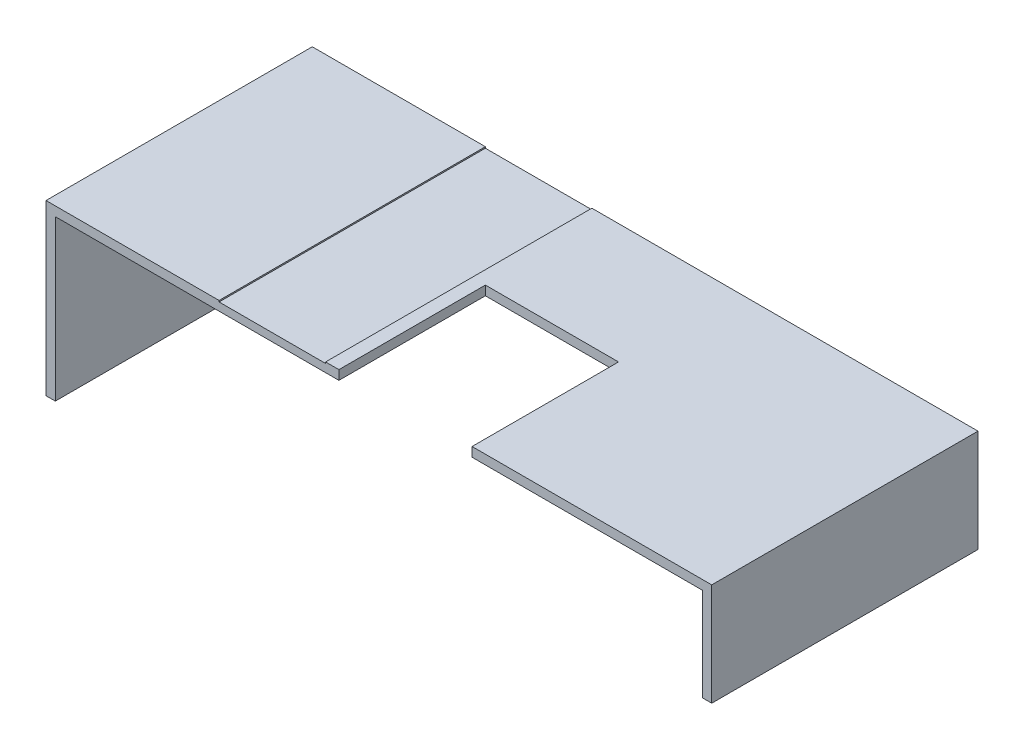
ISO-10303-21;
HEADER;
FILE_DESCRIPTION(('STEP AP214'),'2;1');
FILE_NAME('part.step','',(''),(''),'','','');
FILE_SCHEMA(('AUTOMOTIVE_DESIGN { 1 0 10303 214 1 1 1 1 }'));
ENDSEC;
DATA;
#1=APPLICATION_CONTEXT('core data for automotive mechanical design processes');
#2=APPLICATION_PROTOCOL_DEFINITION('international standard','automotive_design',2000,#1);
#3=PRODUCT_CONTEXT('',#1,'mechanical');
#4=PRODUCT('Part','Part','',(#3));
#5=PRODUCT_RELATED_PRODUCT_CATEGORY('part','',(#4));
#6=PRODUCT_DEFINITION_FORMATION('','',#4);
#7=PRODUCT_DEFINITION_CONTEXT('part definition',#1,'design');
#8=PRODUCT_DEFINITION('design','',#6,#7);
#9=PRODUCT_DEFINITION_SHAPE('','',#8);
#10=(LENGTH_UNIT() NAMED_UNIT(*) SI_UNIT(.MILLI.,.METRE.));
#11=(NAMED_UNIT(*) PLANE_ANGLE_UNIT() SI_UNIT($,.RADIAN.));
#12=(NAMED_UNIT(*) SI_UNIT($,.STERADIAN.) SOLID_ANGLE_UNIT());
#13=UNCERTAINTY_MEASURE_WITH_UNIT(LENGTH_MEASURE(1.E-05),#10,'distance_accuracy_value','');
#14=(GEOMETRIC_REPRESENTATION_CONTEXT(3) GLOBAL_UNCERTAINTY_ASSIGNED_CONTEXT((#13)) GLOBAL_UNIT_ASSIGNED_CONTEXT((#10,
#11,#12)) REPRESENTATION_CONTEXT('',''));
#15=CARTESIAN_POINT('',(0.,0.,0.));
#16=DIRECTION('',(0.,0.,1.));
#17=DIRECTION('',(1.,0.,0.));
#18=AXIS2_PLACEMENT_3D('',#15,#16,#17);
#19=CARTESIAN_POINT('',(0.,70.,0.));
#20=DIRECTION('',(0.,-1.,0.));
#21=DIRECTION('',(0.,0.,-1.));
#22=AXIS2_PLACEMENT_3D('',#19,#20,#21);
#23=PLANE('',#22);
#24=DIRECTION('',(1.,0.,0.));
#25=VECTOR('',#24,1.);
#26=CARTESIAN_POINT('',(-2500.,70.,1000.));
#27=LINE('',#26,#25);
#28=CARTESIAN_POINT('',(-2500.,70.,1000.));
#29=VERTEX_POINT('',#28);
#30=CARTESIAN_POINT('',(-1200.,70.,1000.));
#31=VERTEX_POINT('',#30);
#32=EDGE_CURVE('E146',#29,#31,#27,.T.);
#33=ORIENTED_EDGE('',*,*,#32,.T.);
#34=DIRECTION('',(0.,0.,-1.));
#35=VECTOR('',#34,1.);
#36=CARTESIAN_POINT('',(-1200.,70.,-1.1507914881164E-13));
#37=LINE('',#36,#35);
#38=CARTESIAN_POINT('',(-1200.,70.,-1000.));
#39=VERTEX_POINT('',#38);
#40=EDGE_CURVE('E25',#31,#39,#37,.T.);
#41=ORIENTED_EDGE('',*,*,#40,.T.);
#42=DIRECTION('',(-1.,0.,0.));
#43=VECTOR('',#42,1.);
#44=CARTESIAN_POINT('',(-2500.,70.,-1000.));
#45=LINE('',#44,#43);
#46=CARTESIAN_POINT('',(-2500.,70.,-1000.));
#47=VERTEX_POINT('',#46);
#48=EDGE_CURVE('E138',#39,#47,#45,.T.);
#49=ORIENTED_EDGE('',*,*,#48,.T.);
#50=DIRECTION('',(0.,0.,1.));
#51=VECTOR('',#50,1.);
#52=CARTESIAN_POINT('',(-2500.,70.,1000.));
#53=LINE('',#52,#51);
#54=EDGE_CURVE('E198',#47,#29,#53,.T.);
#55=ORIENTED_EDGE('',*,*,#54,.T.);
#56=EDGE_LOOP('',(#33,#41,#49,#55));
#57=FACE_BOUND('',#56,.T.);
#58=ADVANCED_FACE('F17',(#57),#23,.F.);
#59=CARTESIAN_POINT('',(-2500.,70.,1000.));
#60=DIRECTION('',(0.,0.,-1.));
#61=DIRECTION('',(-1.,0.,0.));
#62=AXIS2_PLACEMENT_3D('',#59,#60,#61);
#63=PLANE('',#62);
#64=DIRECTION('',(1.,0.,0.));
#65=VECTOR('',#64,1.);
#66=CARTESIAN_POINT('',(-2500.,60.,1000.));
#67=LINE('',#66,#65);
#68=CARTESIAN_POINT('',(-1200.,60.,1000.));
#69=VERTEX_POINT('',#68);
#70=CARTESIAN_POINT('',(-400.,60.,1000.));
#71=VERTEX_POINT('',#70);
#72=EDGE_CURVE('E263',#69,#71,#67,.T.);
#73=ORIENTED_EDGE('',*,*,#72,.F.);
#74=DIRECTION('',(0.,1.,0.));
#75=VECTOR('',#74,1.);
#76=CARTESIAN_POINT('',(-1200.,70.,1000.));
#77=LINE('',#76,#75);
#78=EDGE_CURVE('E266',#69,#31,#77,.T.);
#79=ORIENTED_EDGE('',*,*,#78,.T.);
#80=ORIENTED_EDGE('',*,*,#32,.F.);
#81=DIRECTION('',(0.,-1.,0.));
#82=VECTOR('',#81,1.);
#83=CARTESIAN_POINT('',(-2500.,70.,1000.));
#84=LINE('',#83,#82);
#85=CARTESIAN_POINT('',(-2500.,-1200.,1000.));
#86=VERTEX_POINT('',#85);
#87=EDGE_CURVE('E145',#29,#86,#84,.T.);
#88=ORIENTED_EDGE('',*,*,#87,.T.);
#89=DIRECTION('',(1.,0.,0.));
#90=VECTOR('',#89,1.);
#91=CARTESIAN_POINT('',(-2500.,-1200.,1000.));
#92=LINE('',#91,#90);
#93=CARTESIAN_POINT('',(-2430.,-1200.,1000.));
#94=VERTEX_POINT('',#93);
#95=EDGE_CURVE('E114',#86,#94,#92,.T.);
#96=ORIENTED_EDGE('',*,*,#95,.T.);
#97=DIRECTION('',(0.,1.,0.));
#98=VECTOR('',#97,1.);
#99=CARTESIAN_POINT('',(-2430.,-1200.,1000.));
#100=LINE('',#99,#98);
#101=CARTESIAN_POINT('',(-2430.,0.,1000.));
#102=VERTEX_POINT('',#101);
#103=EDGE_CURVE('E106',#94,#102,#100,.T.);
#104=ORIENTED_EDGE('',*,*,#103,.T.);
#105=DIRECTION('',(1.,0.,0.));
#106=VECTOR('',#105,1.);
#107=CARTESIAN_POINT('',(-2500.,0.,1000.));
#108=LINE('',#107,#106);
#109=CARTESIAN_POINT('',(-300.,0.,1000.));
#110=VERTEX_POINT('',#109);
#111=EDGE_CURVE('E112',#102,#110,#108,.T.);
#112=ORIENTED_EDGE('',*,*,#111,.T.);
#113=DIRECTION('',(0.,1.,0.));
#114=VECTOR('',#113,1.);
#115=CARTESIAN_POINT('',(-300.,70.,1000.));
#116=LINE('',#115,#114);
#117=CARTESIAN_POINT('',(-300.,70.,1000.));
#118=VERTEX_POINT('',#117);
#119=EDGE_CURVE('E162',#110,#118,#116,.T.);
#120=ORIENTED_EDGE('',*,*,#119,.T.);
#121=CARTESIAN_POINT('',(-400.,70.,1000.));
#122=VERTEX_POINT('',#121);
#123=EDGE_CURVE('E201',#122,#118,#27,.T.);
#124=ORIENTED_EDGE('',*,*,#123,.F.);
#125=DIRECTION('',(0.,-1.,0.));
#126=VECTOR('',#125,1.);
#127=CARTESIAN_POINT('',(-400.,70.,1000.));
#128=LINE('',#127,#126);
#129=EDGE_CURVE('E32',#122,#71,#128,.T.);
#130=ORIENTED_EDGE('',*,*,#129,.T.);
#131=EDGE_LOOP('',(#73,#79,#80,#88,#96,#104,#112,#120,#124,#130));
#132=FACE_BOUND('',#131,.T.);
#133=ADVANCED_FACE('F109',(#132),#63,.F.);
#134=CARTESIAN_POINT('',(2500.,70.,1000.));
#135=DIRECTION('',(-1.,0.,0.));
#136=DIRECTION('',(0.,0.,1.));
#137=AXIS2_PLACEMENT_3D('',#134,#135,#136);
#138=PLANE('',#137);
#139=DIRECTION('',(0.,-1.,0.));
#140=VECTOR('',#139,1.);
#141=CARTESIAN_POINT('',(2500.,70.,1000.));
#142=LINE('',#141,#140);
#143=CARTESIAN_POINT('',(2500.,70.,1000.));
#144=VERTEX_POINT('',#143);
#145=CARTESIAN_POINT('',(2500.,-700.,1000.));
#146=VERTEX_POINT('',#145);
#147=EDGE_CURVE('E64',#144,#146,#142,.T.);
#148=ORIENTED_EDGE('',*,*,#147,.T.);
#149=DIRECTION('',(0.,0.,-1.));
#150=VECTOR('',#149,1.);
#151=CARTESIAN_POINT('',(2500.,-700.,0.));
#152=LINE('',#151,#150);
#153=CARTESIAN_POINT('',(2500.,-700.,-1000.));
#154=VERTEX_POINT('',#153);
#155=EDGE_CURVE('E159',#146,#154,#152,.T.);
#156=ORIENTED_EDGE('',*,*,#155,.T.);
#157=DIRECTION('',(0.,-1.,0.));
#158=VECTOR('',#157,1.);
#159=CARTESIAN_POINT('',(2500.,70.,-1000.));
#160=LINE('',#159,#158);
#161=CARTESIAN_POINT('',(2500.,70.,-1000.));
#162=VERTEX_POINT('',#161);
#163=EDGE_CURVE('E128',#162,#154,#160,.T.);
#164=ORIENTED_EDGE('',*,*,#163,.F.);
#165=DIRECTION('',(0.,0.,-1.));
#166=VECTOR('',#165,1.);
#167=CARTESIAN_POINT('',(2500.,70.,1000.));
#168=LINE('',#167,#166);
#169=EDGE_CURVE('E135',#144,#162,#168,.T.);
#170=ORIENTED_EDGE('',*,*,#169,.F.);
#171=EDGE_LOOP('',(#148,#156,#164,#170));
#172=FACE_BOUND('',#171,.T.);
#173=ADVANCED_FACE('F213',(#172),#138,.F.);
#174=CARTESIAN_POINT('',(-2500.,70.,-1000.));
#175=DIRECTION('',(0.,0.,1.));
#176=DIRECTION('',(1.,0.,0.));
#177=AXIS2_PLACEMENT_3D('',#174,#175,#176);
#178=PLANE('',#177);
#179=ORIENTED_EDGE('',*,*,#48,.F.);
#180=DIRECTION('',(0.,-1.,0.));
#181=VECTOR('',#180,1.);
#182=CARTESIAN_POINT('',(-1200.,70.,-1000.));
#183=LINE('',#182,#181);
#184=CARTESIAN_POINT('',(-1200.,60.,-1000.));
#185=VERTEX_POINT('',#184);
#186=EDGE_CURVE('E192',#39,#185,#183,.T.);
#187=ORIENTED_EDGE('',*,*,#186,.T.);
#188=DIRECTION('',(-1.,0.,0.));
#189=VECTOR('',#188,1.);
#190=CARTESIAN_POINT('',(-2500.,60.,-1000.));
#191=LINE('',#190,#189);
#192=CARTESIAN_POINT('',(-400.,60.,-1000.));
#193=VERTEX_POINT('',#192);
#194=EDGE_CURVE('E11',#193,#185,#191,.T.);
#195=ORIENTED_EDGE('',*,*,#194,.F.);
#196=DIRECTION('',(0.,1.,0.));
#197=VECTOR('',#196,1.);
#198=CARTESIAN_POINT('',(-400.,70.,-1000.));
#199=LINE('',#198,#197);
#200=CARTESIAN_POINT('',(-400.,70.,-1000.));
#201=VERTEX_POINT('',#200);
#202=EDGE_CURVE('E270',#193,#201,#199,.T.);
#203=ORIENTED_EDGE('',*,*,#202,.T.);
#204=EDGE_CURVE('E195',#162,#201,#45,.T.);
#205=ORIENTED_EDGE('',*,*,#204,.F.);
#206=ORIENTED_EDGE('',*,*,#163,.T.);
#207=DIRECTION('',(-1.,0.,0.));
#208=VECTOR('',#207,1.);
#209=CARTESIAN_POINT('',(0.,-700.,-1000.));
#210=LINE('',#209,#208);
#211=CARTESIAN_POINT('',(2430.,-700.,-1000.));
#212=VERTEX_POINT('',#211);
#213=EDGE_CURVE('E161',#154,#212,#210,.T.);
#214=ORIENTED_EDGE('',*,*,#213,.T.);
#215=DIRECTION('',(0.,1.,0.));
#216=VECTOR('',#215,1.);
#217=CARTESIAN_POINT('',(2430.,-1200.,-1000.));
#218=LINE('',#217,#216);
#219=CARTESIAN_POINT('',(2430.,0.,-1000.));
#220=VERTEX_POINT('',#219);
#221=EDGE_CURVE('E171',#212,#220,#218,.T.);
#222=ORIENTED_EDGE('',*,*,#221,.T.);
#223=DIRECTION('',(-1.,0.,0.));
#224=VECTOR('',#223,1.);
#225=CARTESIAN_POINT('',(-2500.,0.,-1000.));
#226=LINE('',#225,#224);
#227=CARTESIAN_POINT('',(-2430.,-4.44089209850063E-13,-1000.));
#228=VERTEX_POINT('',#227);
#229=EDGE_CURVE('E140',#220,#228,#226,.T.);
#230=ORIENTED_EDGE('',*,*,#229,.T.);
#231=DIRECTION('',(0.,1.,0.));
#232=VECTOR('',#231,1.);
#233=CARTESIAN_POINT('',(-2430.,-1200.,-1000.));
#234=LINE('',#233,#232);
#235=CARTESIAN_POINT('',(-2430.,-1200.,-1000.));
#236=VERTEX_POINT('',#235);
#237=EDGE_CURVE('E118',#236,#228,#234,.T.);
#238=ORIENTED_EDGE('',*,*,#237,.F.);
#239=DIRECTION('',(-1.,0.,0.));
#240=VECTOR('',#239,1.);
#241=CARTESIAN_POINT('',(-2500.,-1200.,-1000.));
#242=LINE('',#241,#240);
#243=CARTESIAN_POINT('',(-2500.,-1200.,-1000.));
#244=VERTEX_POINT('',#243);
#245=EDGE_CURVE('E119',#236,#244,#242,.T.);
#246=ORIENTED_EDGE('',*,*,#245,.T.);
#247=DIRECTION('',(0.,-1.,0.));
#248=VECTOR('',#247,1.);
#249=CARTESIAN_POINT('',(-2500.,70.,-1000.));
#250=LINE('',#249,#248);
#251=EDGE_CURVE('E148',#47,#244,#250,.T.);
#252=ORIENTED_EDGE('',*,*,#251,.F.);
#253=EDGE_LOOP('',(#179,#187,#195,#203,#205,#206,#214,#222,#230,#238,#246,#252));
#254=FACE_BOUND('',#253,.T.);
#255=ADVANCED_FACE('F189',(#254),#178,.F.);
#256=CARTESIAN_POINT('',(-2500.,70.,1000.));
#257=DIRECTION('',(1.,0.,0.));
#258=DIRECTION('',(0.,0.,-1.));
#259=AXIS2_PLACEMENT_3D('',#256,#257,#258);
#260=PLANE('',#259);
#261=ORIENTED_EDGE('',*,*,#251,.T.);
#262=DIRECTION('',(0.,0.,1.));
#263=VECTOR('',#262,1.);
#264=CARTESIAN_POINT('',(-2500.,-1200.,-1000.));
#265=LINE('',#264,#263);
#266=EDGE_CURVE('E223',#244,#86,#265,.T.);
#267=ORIENTED_EDGE('',*,*,#266,.T.);
#268=ORIENTED_EDGE('',*,*,#87,.F.);
#269=ORIENTED_EDGE('',*,*,#54,.F.);
#270=EDGE_LOOP('',(#261,#267,#268,#269));
#271=FACE_BOUND('',#270,.T.);
#272=ADVANCED_FACE('F320',(#271),#260,.F.);
#273=CARTESIAN_POINT('',(700.,70.,1000.));
#274=VERTEX_POINT('',#273);
#275=EDGE_CURVE('E200',#274,#144,#27,.T.);
#276=ORIENTED_EDGE('',*,*,#275,.F.);
#277=DIRECTION('',(0.,-1.,0.));
#278=VECTOR('',#277,1.);
#279=CARTESIAN_POINT('',(700.,70.,1000.));
#280=LINE('',#279,#278);
#281=CARTESIAN_POINT('',(700.,0.,1000.));
#282=VERTEX_POINT('',#281);
#283=EDGE_CURVE('E252',#274,#282,#280,.T.);
#284=ORIENTED_EDGE('',*,*,#283,.T.);
#285=CARTESIAN_POINT('',(2430.,-4.44089209850063E-13,1000.));
#286=VERTEX_POINT('',#285);
#287=EDGE_CURVE('E72',#282,#286,#108,.T.);
#288=ORIENTED_EDGE('',*,*,#287,.T.);
#289=DIRECTION('',(0.,1.,0.));
#290=VECTOR('',#289,1.);
#291=CARTESIAN_POINT('',(2430.,-1200.,1000.));
#292=LINE('',#291,#290);
#293=CARTESIAN_POINT('',(2430.,-700.,1000.));
#294=VERTEX_POINT('',#293);
#295=EDGE_CURVE('E220',#294,#286,#292,.T.);
#296=ORIENTED_EDGE('',*,*,#295,.F.);
#297=DIRECTION('',(1.,0.,0.));
#298=VECTOR('',#297,1.);
#299=CARTESIAN_POINT('',(0.,-700.,1000.));
#300=LINE('',#299,#298);
#301=EDGE_CURVE('E168',#294,#146,#300,.T.);
#302=ORIENTED_EDGE('',*,*,#301,.T.);
#303=ORIENTED_EDGE('',*,*,#147,.F.);
#304=EDGE_LOOP('',(#276,#284,#288,#296,#302,#303));
#305=FACE_BOUND('',#304,.T.);
#306=ADVANCED_FACE('F211',(#305),#63,.F.);
#307=ORIENTED_EDGE('',*,*,#204,.T.);
#308=DIRECTION('',(0.,0.,1.));
#309=VECTOR('',#308,1.);
#310=CARTESIAN_POINT('',(-400.,70.,0.));
#311=LINE('',#310,#309);
#312=EDGE_CURVE('E158',#201,#122,#311,.T.);
#313=ORIENTED_EDGE('',*,*,#312,.T.);
#314=ORIENTED_EDGE('',*,*,#123,.T.);
#315=DIRECTION('',(0.,0.,1.));
#316=VECTOR('',#315,1.);
#317=CARTESIAN_POINT('',(-300.,70.,-100.));
#318=LINE('',#317,#316);
#319=CARTESIAN_POINT('',(-300.,70.,-100.));
#320=VERTEX_POINT('',#319);
#321=EDGE_CURVE('E251',#320,#118,#318,.T.);
#322=ORIENTED_EDGE('',*,*,#321,.F.);
#323=DIRECTION('',(-1.,0.,0.));
#324=VECTOR('',#323,1.);
#325=CARTESIAN_POINT('',(-300.,70.,-100.));
#326=LINE('',#325,#324);
#327=CARTESIAN_POINT('',(700.,70.,-100.));
#328=VERTEX_POINT('',#327);
#329=EDGE_CURVE('E257',#328,#320,#326,.T.);
#330=ORIENTED_EDGE('',*,*,#329,.F.);
#331=DIRECTION('',(0.,0.,-1.));
#332=VECTOR('',#331,1.);
#333=CARTESIAN_POINT('',(700.,70.,-100.));
#334=LINE('',#333,#332);
#335=EDGE_CURVE('E210',#274,#328,#334,.T.);
#336=ORIENTED_EDGE('',*,*,#335,.F.);
#337=ORIENTED_EDGE('',*,*,#275,.T.);
#338=ORIENTED_EDGE('',*,*,#169,.T.);
#339=EDGE_LOOP('',(#307,#313,#314,#322,#330,#336,#337,#338));
#340=FACE_BOUND('',#339,.T.);
#341=ADVANCED_FACE('F206',(#340),#23,.F.);
#342=CARTESIAN_POINT('',(0.,0.,0.));
#343=DIRECTION('',(0.,-1.,0.));
#344=DIRECTION('',(0.,0.,-1.));
#345=AXIS2_PLACEMENT_3D('',#342,#343,#344);
#346=PLANE('',#345);
#347=DIRECTION('',(0.,0.,-1.));
#348=VECTOR('',#347,1.);
#349=CARTESIAN_POINT('',(-300.,0.,2.36903325628085E-13));
#350=LINE('',#349,#348);
#351=CARTESIAN_POINT('',(-300.,-4.44089209850063E-13,-100.));
#352=VERTEX_POINT('',#351);
#353=EDGE_CURVE('E134',#110,#352,#350,.T.);
#354=ORIENTED_EDGE('',*,*,#353,.F.);
#355=ORIENTED_EDGE('',*,*,#111,.F.);
#356=DIRECTION('',(0.,0.,1.));
#357=VECTOR('',#356,1.);
#358=CARTESIAN_POINT('',(-2430.,0.,5.39568389967826E-13));
#359=LINE('',#358,#357);
#360=EDGE_CURVE('E123',#228,#102,#359,.T.);
#361=ORIENTED_EDGE('',*,*,#360,.F.);
#362=ORIENTED_EDGE('',*,*,#229,.F.);
#363=DIRECTION('',(0.,0.,-1.));
#364=VECTOR('',#363,1.);
#365=CARTESIAN_POINT('',(2430.,0.,5.39568389967826E-13));
#366=LINE('',#365,#364);
#367=EDGE_CURVE('E127',#286,#220,#366,.T.);
#368=ORIENTED_EDGE('',*,*,#367,.F.);
#369=ORIENTED_EDGE('',*,*,#287,.F.);
#370=DIRECTION('',(0.,0.,1.));
#371=VECTOR('',#370,1.);
#372=CARTESIAN_POINT('',(700.,0.,-6.14193807183925E-13));
#373=LINE('',#372,#371);
#374=CARTESIAN_POINT('',(700.,0.,-100.));
#375=VERTEX_POINT('',#374);
#376=EDGE_CURVE('E153',#375,#282,#373,.T.);
#377=ORIENTED_EDGE('',*,*,#376,.F.);
#378=DIRECTION('',(1.,0.,0.));
#379=VECTOR('',#378,1.);
#380=CARTESIAN_POINT('',(0.,0.,-100.));
#381=LINE('',#380,#379);
#382=EDGE_CURVE('E155',#352,#375,#381,.T.);
#383=ORIENTED_EDGE('',*,*,#382,.F.);
#384=EDGE_LOOP('',(#354,#355,#361,#362,#368,#369,#377,#383));
#385=FACE_BOUND('',#384,.T.);
#386=ADVANCED_FACE('F131',(#385),#346,.T.);
#387=CARTESIAN_POINT('',(-2430.,-1200.,-1000.));
#388=DIRECTION('',(1.,0.,0.));
#389=DIRECTION('',(0.,0.,-1.));
#390=AXIS2_PLACEMENT_3D('',#387,#388,#389);
#391=PLANE('',#390);
#392=ORIENTED_EDGE('',*,*,#237,.T.);
#393=ORIENTED_EDGE('',*,*,#360,.T.);
#394=ORIENTED_EDGE('',*,*,#103,.F.);
#395=DIRECTION('',(0.,0.,-1.));
#396=VECTOR('',#395,1.);
#397=CARTESIAN_POINT('',(-2430.,-1200.,-1000.));
#398=LINE('',#397,#396);
#399=EDGE_CURVE('E230',#94,#236,#398,.T.);
#400=ORIENTED_EDGE('',*,*,#399,.T.);
#401=EDGE_LOOP('',(#392,#393,#394,#400));
#402=FACE_BOUND('',#401,.T.);
#403=ADVANCED_FACE('F124',(#402),#391,.T.);
#404=CARTESIAN_POINT('',(0.,-1200.,0.));
#405=DIRECTION('',(0.,1.,0.));
#406=DIRECTION('',(0.,0.,1.));
#407=AXIS2_PLACEMENT_3D('',#404,#405,#406);
#408=PLANE('',#407);
#409=ORIENTED_EDGE('',*,*,#266,.F.);
#410=ORIENTED_EDGE('',*,*,#245,.F.);
#411=ORIENTED_EDGE('',*,*,#399,.F.);
#412=ORIENTED_EDGE('',*,*,#95,.F.);
#413=EDGE_LOOP('',(#409,#410,#411,#412));
#414=FACE_BOUND('',#413,.T.);
#415=ADVANCED_FACE('F372',(#414),#408,.F.);
#416=CARTESIAN_POINT('',(2430.,-1200.,-1000.));
#417=DIRECTION('',(-1.,0.,0.));
#418=DIRECTION('',(0.,0.,1.));
#419=AXIS2_PLACEMENT_3D('',#416,#417,#418);
#420=PLANE('',#419);
#421=ORIENTED_EDGE('',*,*,#295,.T.);
#422=ORIENTED_EDGE('',*,*,#367,.T.);
#423=ORIENTED_EDGE('',*,*,#221,.F.);
#424=DIRECTION('',(0.,0.,1.));
#425=VECTOR('',#424,1.);
#426=CARTESIAN_POINT('',(2430.,-700.,-1000.));
#427=LINE('',#426,#425);
#428=EDGE_CURVE('E165',#212,#294,#427,.T.);
#429=ORIENTED_EDGE('',*,*,#428,.T.);
#430=EDGE_LOOP('',(#421,#422,#423,#429));
#431=FACE_BOUND('',#430,.T.);
#432=ADVANCED_FACE('F219',(#431),#420,.T.);
#433=CARTESIAN_POINT('',(0.,-700.,0.));
#434=DIRECTION('',(0.,-1.,0.));
#435=DIRECTION('',(0.,0.,-1.));
#436=AXIS2_PLACEMENT_3D('',#433,#434,#435);
#437=PLANE('',#436);
#438=ORIENTED_EDGE('',*,*,#155,.F.);
#439=ORIENTED_EDGE('',*,*,#301,.F.);
#440=ORIENTED_EDGE('',*,*,#428,.F.);
#441=ORIENTED_EDGE('',*,*,#213,.F.);
#442=EDGE_LOOP('',(#438,#439,#440,#441));
#443=FACE_BOUND('',#442,.T.);
#444=ADVANCED_FACE('F19',(#443),#437,.T.);
#445=CARTESIAN_POINT('',(-300.,-1200.,-100.));
#446=DIRECTION('',(-1.,0.,0.));
#447=DIRECTION('',(0.,0.,1.));
#448=AXIS2_PLACEMENT_3D('',#445,#446,#447);
#449=PLANE('',#448);
#450=ORIENTED_EDGE('',*,*,#353,.T.);
#451=DIRECTION('',(0.,1.,0.));
#452=VECTOR('',#451,1.);
#453=CARTESIAN_POINT('',(-300.,-1200.,-100.));
#454=LINE('',#453,#452);
#455=EDGE_CURVE('E253',#352,#320,#454,.T.);
#456=ORIENTED_EDGE('',*,*,#455,.T.);
#457=ORIENTED_EDGE('',*,*,#321,.T.);
#458=ORIENTED_EDGE('',*,*,#119,.F.);
#459=EDGE_LOOP('',(#450,#456,#457,#458));
#460=FACE_BOUND('',#459,.T.);
#461=ADVANCED_FACE('F248',(#460),#449,.F.);
#462=CARTESIAN_POINT('',(700.,-1200.,-100.));
#463=DIRECTION('',(1.,0.,0.));
#464=DIRECTION('',(0.,0.,-1.));
#465=AXIS2_PLACEMENT_3D('',#462,#463,#464);
#466=PLANE('',#465);
#467=ORIENTED_EDGE('',*,*,#335,.T.);
#468=DIRECTION('',(0.,1.,0.));
#469=VECTOR('',#468,1.);
#470=CARTESIAN_POINT('',(700.,-1200.,-100.));
#471=LINE('',#470,#469);
#472=EDGE_CURVE('E41',#375,#328,#471,.T.);
#473=ORIENTED_EDGE('',*,*,#472,.F.);
#474=ORIENTED_EDGE('',*,*,#376,.T.);
#475=ORIENTED_EDGE('',*,*,#283,.F.);
#476=EDGE_LOOP('',(#467,#473,#474,#475));
#477=FACE_BOUND('',#476,.T.);
#478=ADVANCED_FACE('F294',(#477),#466,.F.);
#479=CARTESIAN_POINT('',(-300.,-1200.,-100.));
#480=DIRECTION('',(0.,0.,-1.));
#481=DIRECTION('',(-1.,0.,0.));
#482=AXIS2_PLACEMENT_3D('',#479,#480,#481);
#483=PLANE('',#482);
#484=ORIENTED_EDGE('',*,*,#382,.T.);
#485=ORIENTED_EDGE('',*,*,#472,.T.);
#486=ORIENTED_EDGE('',*,*,#329,.T.);
#487=ORIENTED_EDGE('',*,*,#455,.F.);
#488=EDGE_LOOP('',(#484,#485,#486,#487));
#489=FACE_BOUND('',#488,.T.);
#490=ADVANCED_FACE('F293',(#489),#483,.F.);
#491=CARTESIAN_POINT('',(0.,60.,0.));
#492=DIRECTION('',(0.,1.,0.));
#493=DIRECTION('',(0.,0.,1.));
#494=AXIS2_PLACEMENT_3D('',#491,#492,#493);
#495=PLANE('',#494);
#496=ORIENTED_EDGE('',*,*,#72,.T.);
#497=DIRECTION('',(0.,0.,-1.));
#498=VECTOR('',#497,1.);
#499=CARTESIAN_POINT('',(-400.,60.,-1139.8936106952));
#500=LINE('',#499,#498);
#501=EDGE_CURVE('E272',#71,#193,#500,.T.);
#502=ORIENTED_EDGE('',*,*,#501,.T.);
#503=ORIENTED_EDGE('',*,*,#194,.T.);
#504=DIRECTION('',(0.,0.,1.));
#505=VECTOR('',#504,1.);
#506=CARTESIAN_POINT('',(-1200.,60.,-1139.8936106952));
#507=LINE('',#506,#505);
#508=EDGE_CURVE('E275',#185,#69,#507,.T.);
#509=ORIENTED_EDGE('',*,*,#508,.T.);
#510=EDGE_LOOP('',(#496,#502,#503,#509));
#511=FACE_BOUND('',#510,.T.);
#512=ADVANCED_FACE('F280',(#511),#495,.T.);
#513=CARTESIAN_POINT('',(-1200.,60.,-1139.8936106952));
#514=DIRECTION('',(-1.,0.,0.));
#515=DIRECTION('',(0.,0.,1.));
#516=AXIS2_PLACEMENT_3D('',#513,#514,#515);
#517=PLANE('',#516);
#518=ORIENTED_EDGE('',*,*,#508,.F.);
#519=ORIENTED_EDGE('',*,*,#186,.F.);
#520=ORIENTED_EDGE('',*,*,#40,.F.);
#521=ORIENTED_EDGE('',*,*,#78,.F.);
#522=EDGE_LOOP('',(#518,#519,#520,#521));
#523=FACE_BOUND('',#522,.T.);
#524=ADVANCED_FACE('F421',(#523),#517,.F.);
#525=CARTESIAN_POINT('',(-400.,60.,-1139.8936106952));
#526=DIRECTION('',(1.,0.,0.));
#527=DIRECTION('',(0.,0.,-1.));
#528=AXIS2_PLACEMENT_3D('',#525,#526,#527);
#529=PLANE('',#528);
#530=ORIENTED_EDGE('',*,*,#312,.F.);
#531=ORIENTED_EDGE('',*,*,#202,.F.);
#532=ORIENTED_EDGE('',*,*,#501,.F.);
#533=ORIENTED_EDGE('',*,*,#129,.F.);
#534=EDGE_LOOP('',(#530,#531,#532,#533));
#535=FACE_BOUND('',#534,.T.);
#536=ADVANCED_FACE('F430',(#535),#529,.F.);
#537=CLOSED_SHELL('',(#58,#133,#173,#255,#272,#306,#341,#386,#403,#415,#432,#444,#461,#478,#490,
#512,#524,#536));
#538=MANIFOLD_SOLID_BREP('B1',#537);
#539=ADVANCED_BREP_SHAPE_REPRESENTATION('',(#18,#538),#14);
#540=SHAPE_DEFINITION_REPRESENTATION(#9,#539);
ENDSEC;
END-ISO-10303-21;
